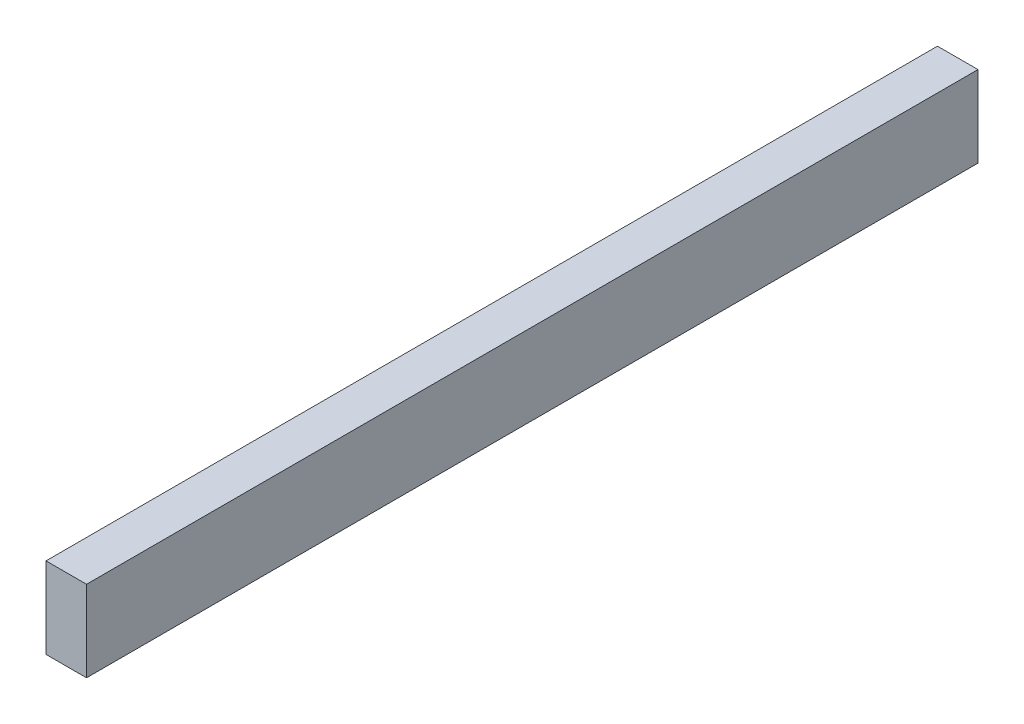
ISO-10303-21;
HEADER;
FILE_DESCRIPTION(('STEP AP214'),'2;1');
FILE_NAME('part.step','',(''),(''),'','','');
FILE_SCHEMA(('AUTOMOTIVE_DESIGN { 1 0 10303 214 1 1 1 1 }'));
ENDSEC;
DATA;
#1=APPLICATION_CONTEXT('core data for automotive mechanical design processes');
#2=APPLICATION_PROTOCOL_DEFINITION('international standard','automotive_design',2000,#1);
#3=PRODUCT_CONTEXT('',#1,'mechanical');
#4=PRODUCT('Part','Part','',(#3));
#5=PRODUCT_RELATED_PRODUCT_CATEGORY('part','',(#4));
#6=PRODUCT_DEFINITION_FORMATION('','',#4);
#7=PRODUCT_DEFINITION_CONTEXT('part definition',#1,'design');
#8=PRODUCT_DEFINITION('design','',#6,#7);
#9=PRODUCT_DEFINITION_SHAPE('','',#8);
#10=(LENGTH_UNIT() NAMED_UNIT(*) SI_UNIT(.MILLI.,.METRE.));
#11=(NAMED_UNIT(*) PLANE_ANGLE_UNIT() SI_UNIT($,.RADIAN.));
#12=(NAMED_UNIT(*) SI_UNIT($,.STERADIAN.) SOLID_ANGLE_UNIT());
#13=UNCERTAINTY_MEASURE_WITH_UNIT(LENGTH_MEASURE(1.E-05),#10,'distance_accuracy_value','');
#14=(GEOMETRIC_REPRESENTATION_CONTEXT(3) GLOBAL_UNCERTAINTY_ASSIGNED_CONTEXT((#13)) GLOBAL_UNIT_ASSIGNED_CONTEXT((#10,
#11,#12)) REPRESENTATION_CONTEXT('',''));
#15=CARTESIAN_POINT('',(0.,0.,0.));
#16=DIRECTION('',(0.,0.,1.));
#17=DIRECTION('',(1.,0.,0.));
#18=AXIS2_PLACEMENT_3D('',#15,#16,#17);
#19=CARTESIAN_POINT('',(12.6999999999999,50.8,-279.4));
#20=DIRECTION('',(-1.,0.,0.));
#21=DIRECTION('',(0.,0.,1.));
#22=AXIS2_PLACEMENT_3D('',#19,#20,#21);
#23=PLANE('',#22);
#24=DIRECTION('',(0.,0.,-1.));
#25=VECTOR('',#24,1.);
#26=CARTESIAN_POINT('',(12.6999999999999,0.,-279.4));
#27=LINE('',#26,#25);
#28=CARTESIAN_POINT('',(12.7,0.,279.4));
#29=VERTEX_POINT('',#28);
#30=CARTESIAN_POINT('',(12.6999999999999,0.,-279.4));
#31=VERTEX_POINT('',#30);
#32=EDGE_CURVE('E102',#29,#31,#27,.T.);
#33=ORIENTED_EDGE('',*,*,#32,.T.);
#34=DIRECTION('',(0.,-1.,0.));
#35=VECTOR('',#34,1.);
#36=CARTESIAN_POINT('',(12.6999999999999,50.8,-279.4));
#37=LINE('',#36,#35);
#38=CARTESIAN_POINT('',(12.6999999999999,50.8,-279.4));
#39=VERTEX_POINT('',#38);
#40=EDGE_CURVE('E11',#39,#31,#37,.T.);
#41=ORIENTED_EDGE('',*,*,#40,.F.);
#42=DIRECTION('',(0.,0.,-1.));
#43=VECTOR('',#42,1.);
#44=CARTESIAN_POINT('',(12.6999999999999,50.8,-279.4));
#45=LINE('',#44,#43);
#46=CARTESIAN_POINT('',(12.7,50.8,279.4));
#47=VERTEX_POINT('',#46);
#48=EDGE_CURVE('E90',#47,#39,#45,.T.);
#49=ORIENTED_EDGE('',*,*,#48,.F.);
#50=DIRECTION('',(0.,-1.,0.));
#51=VECTOR('',#50,1.);
#52=CARTESIAN_POINT('',(12.7,50.8,279.4));
#53=LINE('',#52,#51);
#54=EDGE_CURVE('E98',#47,#29,#53,.T.);
#55=ORIENTED_EDGE('',*,*,#54,.T.);
#56=EDGE_LOOP('',(#33,#41,#49,#55));
#57=FACE_BOUND('',#56,.T.);
#58=ADVANCED_FACE('F39',(#57),#23,.F.);
#59=CARTESIAN_POINT('',(-12.7,50.8,-279.4));
#60=DIRECTION('',(0.,0.,1.));
#61=DIRECTION('',(1.,0.,0.));
#62=AXIS2_PLACEMENT_3D('',#59,#60,#61);
#63=PLANE('',#62);
#64=DIRECTION('',(-1.,0.,0.));
#65=VECTOR('',#64,1.);
#66=CARTESIAN_POINT('',(-12.7,0.,-279.4));
#67=LINE('',#66,#65);
#68=CARTESIAN_POINT('',(-12.7,0.,-279.4));
#69=VERTEX_POINT('',#68);
#70=EDGE_CURVE('E94',#31,#69,#67,.T.);
#71=ORIENTED_EDGE('',*,*,#70,.T.);
#72=DIRECTION('',(0.,-1.,0.));
#73=VECTOR('',#72,1.);
#74=CARTESIAN_POINT('',(-12.7,50.8,-279.4));
#75=LINE('',#74,#73);
#76=CARTESIAN_POINT('',(-12.7,50.8,-279.4));
#77=VERTEX_POINT('',#76);
#78=EDGE_CURVE('E47',#77,#69,#75,.T.);
#79=ORIENTED_EDGE('',*,*,#78,.F.);
#80=DIRECTION('',(-1.,0.,0.));
#81=VECTOR('',#80,1.);
#82=CARTESIAN_POINT('',(-12.7,50.8,-279.4));
#83=LINE('',#82,#81);
#84=EDGE_CURVE('E85',#39,#77,#83,.T.);
#85=ORIENTED_EDGE('',*,*,#84,.F.);
#86=ORIENTED_EDGE('',*,*,#40,.T.);
#87=EDGE_LOOP('',(#71,#79,#85,#86));
#88=FACE_BOUND('',#87,.T.);
#89=ADVANCED_FACE('F93',(#88),#63,.F.);
#90=CARTESIAN_POINT('',(-12.7,50.8,-279.4));
#91=DIRECTION('',(1.,0.,0.));
#92=DIRECTION('',(0.,0.,-1.));
#93=AXIS2_PLACEMENT_3D('',#90,#91,#92);
#94=PLANE('',#93);
#95=DIRECTION('',(0.,0.,1.));
#96=VECTOR('',#95,1.);
#97=CARTESIAN_POINT('',(-12.7,0.,-279.4));
#98=LINE('',#97,#96);
#99=CARTESIAN_POINT('',(-12.7,0.,279.4));
#100=VERTEX_POINT('',#99);
#101=EDGE_CURVE('E72',#69,#100,#98,.T.);
#102=ORIENTED_EDGE('',*,*,#101,.T.);
#103=DIRECTION('',(0.,-1.,0.));
#104=VECTOR('',#103,1.);
#105=CARTESIAN_POINT('',(-12.7,50.8,279.4));
#106=LINE('',#105,#104);
#107=CARTESIAN_POINT('',(-12.7,50.8,279.4));
#108=VERTEX_POINT('',#107);
#109=EDGE_CURVE('E95',#108,#100,#106,.T.);
#110=ORIENTED_EDGE('',*,*,#109,.F.);
#111=DIRECTION('',(0.,0.,1.));
#112=VECTOR('',#111,1.);
#113=CARTESIAN_POINT('',(-12.7,50.8,-279.4));
#114=LINE('',#113,#112);
#115=EDGE_CURVE('E88',#77,#108,#114,.T.);
#116=ORIENTED_EDGE('',*,*,#115,.F.);
#117=ORIENTED_EDGE('',*,*,#78,.T.);
#118=EDGE_LOOP('',(#102,#110,#116,#117));
#119=FACE_BOUND('',#118,.T.);
#120=ADVANCED_FACE('F96',(#119),#94,.F.);
#121=CARTESIAN_POINT('',(-12.7,50.8,279.4));
#122=DIRECTION('',(0.,0.,-1.));
#123=DIRECTION('',(-1.,0.,0.));
#124=AXIS2_PLACEMENT_3D('',#121,#122,#123);
#125=PLANE('',#124);
#126=DIRECTION('',(1.,0.,0.));
#127=VECTOR('',#126,1.);
#128=CARTESIAN_POINT('',(-12.7,0.,279.4));
#129=LINE('',#128,#127);
#130=EDGE_CURVE('E78',#100,#29,#129,.T.);
#131=ORIENTED_EDGE('',*,*,#130,.T.);
#132=ORIENTED_EDGE('',*,*,#54,.F.);
#133=DIRECTION('',(1.,0.,0.));
#134=VECTOR('',#133,1.);
#135=CARTESIAN_POINT('',(-12.7,50.8,279.4));
#136=LINE('',#135,#134);
#137=EDGE_CURVE('E55',#108,#47,#136,.T.);
#138=ORIENTED_EDGE('',*,*,#137,.F.);
#139=ORIENTED_EDGE('',*,*,#109,.T.);
#140=EDGE_LOOP('',(#131,#132,#138,#139));
#141=FACE_BOUND('',#140,.T.);
#142=ADVANCED_FACE('F109',(#141),#125,.F.);
#143=CARTESIAN_POINT('',(0.,50.8,0.));
#144=DIRECTION('',(0.,1.,0.));
#145=DIRECTION('',(0.,0.,1.));
#146=AXIS2_PLACEMENT_3D('',#143,#144,#145);
#147=PLANE('',#146);
#148=ORIENTED_EDGE('',*,*,#48,.T.);
#149=ORIENTED_EDGE('',*,*,#84,.T.);
#150=ORIENTED_EDGE('',*,*,#115,.T.);
#151=ORIENTED_EDGE('',*,*,#137,.T.);
#152=EDGE_LOOP('',(#148,#149,#150,#151));
#153=FACE_BOUND('',#152,.T.);
#154=ADVANCED_FACE('F86',(#153),#147,.T.);
#155=CARTESIAN_POINT('',(0.,0.,0.));
#156=DIRECTION('',(0.,1.,0.));
#157=DIRECTION('',(0.,0.,1.));
#158=AXIS2_PLACEMENT_3D('',#155,#156,#157);
#159=PLANE('',#158);
#160=ORIENTED_EDGE('',*,*,#32,.F.);
#161=ORIENTED_EDGE('',*,*,#130,.F.);
#162=ORIENTED_EDGE('',*,*,#101,.F.);
#163=ORIENTED_EDGE('',*,*,#70,.F.);
#164=EDGE_LOOP('',(#160,#161,#162,#163));
#165=FACE_BOUND('',#164,.T.);
#166=ADVANCED_FACE('F112',(#165),#159,.F.);
#167=CLOSED_SHELL('',(#58,#89,#120,#142,#154,#166));
#168=MANIFOLD_SOLID_BREP('B2',#167);
#169=ADVANCED_BREP_SHAPE_REPRESENTATION('',(#18,#168),#14);
#170=SHAPE_DEFINITION_REPRESENTATION(#9,#169);
ENDSEC;
END-ISO-10303-21;
